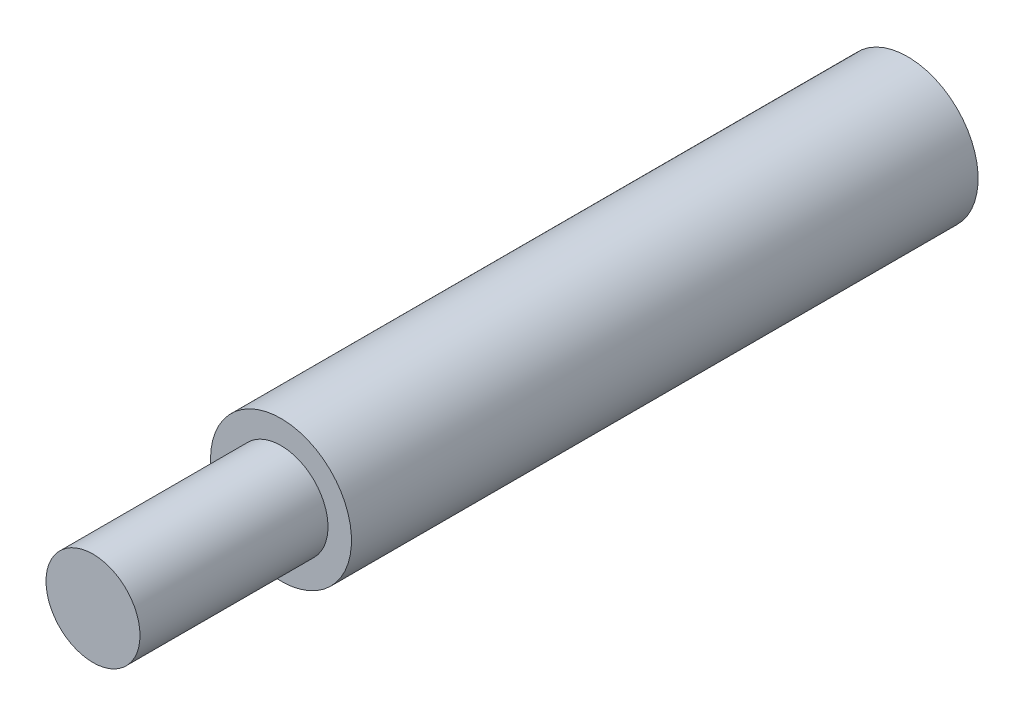
ISO-10303-21;
HEADER;
FILE_DESCRIPTION(('STEP AP214'),'2;1');
FILE_NAME('part.step','',(''),(''),'','','');
FILE_SCHEMA(('AUTOMOTIVE_DESIGN { 1 0 10303 214 1 1 1 1 }'));
ENDSEC;
DATA;
#1=APPLICATION_CONTEXT('core data for automotive mechanical design processes');
#2=APPLICATION_PROTOCOL_DEFINITION('international standard','automotive_design',2000,#1);
#3=PRODUCT_CONTEXT('',#1,'mechanical');
#4=PRODUCT('Part','Part','',(#3));
#5=PRODUCT_RELATED_PRODUCT_CATEGORY('part','',(#4));
#6=PRODUCT_DEFINITION_FORMATION('','',#4);
#7=PRODUCT_DEFINITION_CONTEXT('part definition',#1,'design');
#8=PRODUCT_DEFINITION('design','',#6,#7);
#9=PRODUCT_DEFINITION_SHAPE('','',#8);
#10=(LENGTH_UNIT() NAMED_UNIT(*) SI_UNIT(.MILLI.,.METRE.));
#11=(NAMED_UNIT(*) PLANE_ANGLE_UNIT() SI_UNIT($,.RADIAN.));
#12=(NAMED_UNIT(*) SI_UNIT($,.STERADIAN.) SOLID_ANGLE_UNIT());
#13=UNCERTAINTY_MEASURE_WITH_UNIT(LENGTH_MEASURE(1.E-05),#10,'distance_accuracy_value','');
#14=(GEOMETRIC_REPRESENTATION_CONTEXT(3) GLOBAL_UNCERTAINTY_ASSIGNED_CONTEXT((#13)) GLOBAL_UNIT_ASSIGNED_CONTEXT((#10,
#11,#12)) REPRESENTATION_CONTEXT('',''));
#15=CARTESIAN_POINT('',(0.,0.,0.));
#16=DIRECTION('',(0.,0.,1.));
#17=DIRECTION('',(1.,0.,0.));
#18=AXIS2_PLACEMENT_3D('',#15,#16,#17);
#19=CARTESIAN_POINT('',(0.,0.,6.));
#20=DIRECTION('',(0.,0.,-1.));
#21=DIRECTION('',(-1.,0.,0.));
#22=AXIS2_PLACEMENT_3D('',#19,#20,#21);
#23=CYLINDRICAL_SURFACE('',#22,1.5);
#24=CARTESIAN_POINT('',(0.,0.,6.));
#25=DIRECTION('',(0.,0.,1.));
#26=DIRECTION('',(1.,0.,0.));
#27=AXIS2_PLACEMENT_3D('',#24,#25,#26);
#28=CIRCLE('',#27,1.5);
#29=CARTESIAN_POINT('',(1.5,0.,6.));
#30=VERTEX_POINT('',#29);
#31=EDGE_CURVE('E10',#30,#30,#28,.T.);
#32=ORIENTED_EDGE('',*,*,#31,.F.);
#33=EDGE_LOOP('',(#32));
#34=FACE_BOUND('',#33,.T.);
#35=CARTESIAN_POINT('',(0.,0.,0.));
#36=DIRECTION('',(0.,0.,-1.));
#37=DIRECTION('',(-1.,0.,0.));
#38=AXIS2_PLACEMENT_3D('',#35,#36,#37);
#39=CIRCLE('',#38,1.5);
#40=CARTESIAN_POINT('',(-1.5,0.,0.));
#41=VERTEX_POINT('',#40);
#42=EDGE_CURVE('E39',#41,#41,#39,.T.);
#43=ORIENTED_EDGE('',*,*,#42,.F.);
#44=EDGE_LOOP('',(#43));
#45=FACE_BOUND('',#44,.T.);
#46=ADVANCED_FACE('F33',(#34,#45),#23,.T.);
#47=CARTESIAN_POINT('',(0.,0.,6.));
#48=DIRECTION('',(0.,0.,1.));
#49=DIRECTION('',(1.,0.,0.));
#50=AXIS2_PLACEMENT_3D('',#47,#48,#49);
#51=PLANE('',#50);
#52=ORIENTED_EDGE('',*,*,#31,.T.);
#53=EDGE_LOOP('',(#52));
#54=FACE_BOUND('',#53,.T.);
#55=ADVANCED_FACE('F81',(#54),#51,.T.);
#56=CARTESIAN_POINT('',(0.,0.,0.));
#57=DIRECTION('',(0.,0.,-1.));
#58=DIRECTION('',(-1.,0.,0.));
#59=AXIS2_PLACEMENT_3D('',#56,#57,#58);
#60=PLANE('',#59);
#61=CARTESIAN_POINT('',(0.,0.,0.));
#62=DIRECTION('',(0.,0.,-1.));
#63=DIRECTION('',(-1.,0.,0.));
#64=AXIS2_PLACEMENT_3D('',#61,#62,#63);
#65=CIRCLE('',#64,2.25);
#66=CARTESIAN_POINT('',(-2.25,0.,0.));
#67=VERTEX_POINT('',#66);
#68=EDGE_CURVE('E47',#67,#67,#65,.T.);
#69=ORIENTED_EDGE('',*,*,#68,.F.);
#70=EDGE_LOOP('',(#69));
#71=FACE_BOUND('',#70,.T.);
#72=ORIENTED_EDGE('',*,*,#42,.T.);
#73=EDGE_LOOP('',(#72));
#74=FACE_BOUND('',#73,.T.);
#75=ADVANCED_FACE('F76',(#71,#74),#60,.F.);
#76=CARTESIAN_POINT('',(0.,0.,-20.));
#77=DIRECTION('',(0.,0.,1.));
#78=DIRECTION('',(1.,0.,0.));
#79=AXIS2_PLACEMENT_3D('',#76,#77,#78);
#80=CYLINDRICAL_SURFACE('',#79,2.25);
#81=CARTESIAN_POINT('',(0.,0.,-20.));
#82=DIRECTION('',(0.,0.,-1.));
#83=DIRECTION('',(-1.,0.,0.));
#84=AXIS2_PLACEMENT_3D('',#81,#82,#83);
#85=CIRCLE('',#84,2.25);
#86=CARTESIAN_POINT('',(-2.25,0.,-20.));
#87=VERTEX_POINT('',#86);
#88=EDGE_CURVE('E43',#87,#87,#85,.T.);
#89=ORIENTED_EDGE('',*,*,#88,.F.);
#90=EDGE_LOOP('',(#89));
#91=FACE_BOUND('',#90,.T.);
#92=ORIENTED_EDGE('',*,*,#68,.T.);
#93=EDGE_LOOP('',(#92));
#94=FACE_BOUND('',#93,.T.);
#95=ADVANCED_FACE('F70',(#91,#94),#80,.T.);
#96=CARTESIAN_POINT('',(0.,0.,-20.));
#97=DIRECTION('',(0.,0.,-1.));
#98=DIRECTION('',(-1.,0.,0.));
#99=AXIS2_PLACEMENT_3D('',#96,#97,#98);
#100=PLANE('',#99);
#101=CARTESIAN_POINT('',(0.,0.,-20.));
#102=DIRECTION('',(0.,0.,-1.));
#103=DIRECTION('',(-1.,0.,0.));
#104=AXIS2_PLACEMENT_3D('',#101,#102,#103);
#105=CIRCLE('',#104,1.5);
#106=CARTESIAN_POINT('',(-1.5,0.,-20.));
#107=VERTEX_POINT('',#106);
#108=EDGE_CURVE('E53',#107,#107,#105,.T.);
#109=ORIENTED_EDGE('',*,*,#108,.F.);
#110=EDGE_LOOP('',(#109));
#111=FACE_BOUND('',#110,.T.);
#112=ORIENTED_EDGE('',*,*,#88,.T.);
#113=EDGE_LOOP('',(#112));
#114=FACE_BOUND('',#113,.T.);
#115=ADVANCED_FACE('F64',(#111,#114),#100,.T.);
#116=CARTESIAN_POINT('',(0.,0.,-15.5));
#117=DIRECTION('',(0.,0.,-1.));
#118=DIRECTION('',(-1.,0.,0.));
#119=AXIS2_PLACEMENT_3D('',#116,#117,#118);
#120=CYLINDRICAL_SURFACE('',#119,1.5);
#121=CARTESIAN_POINT('',(0.,0.,-15.5));
#122=DIRECTION('',(0.,0.,-1.));
#123=DIRECTION('',(-1.,0.,0.));
#124=AXIS2_PLACEMENT_3D('',#121,#122,#123);
#125=CIRCLE('',#124,1.5);
#126=CARTESIAN_POINT('',(-1.5,0.,-15.5));
#127=VERTEX_POINT('',#126);
#128=EDGE_CURVE('E51',#127,#127,#125,.T.);
#129=ORIENTED_EDGE('',*,*,#128,.F.);
#130=EDGE_LOOP('',(#129));
#131=FACE_BOUND('',#130,.T.);
#132=ORIENTED_EDGE('',*,*,#108,.T.);
#133=EDGE_LOOP('',(#132));
#134=FACE_BOUND('',#133,.T.);
#135=ADVANCED_FACE('F61',(#131,#134),#120,.F.);
#136=CARTESIAN_POINT('',(0.,0.,-15.5));
#137=DIRECTION('',(0.,0.,-1.));
#138=DIRECTION('',(-1.,0.,0.));
#139=AXIS2_PLACEMENT_3D('',#136,#137,#138);
#140=PLANE('',#139);
#141=ORIENTED_EDGE('',*,*,#128,.T.);
#142=EDGE_LOOP('',(#141));
#143=FACE_BOUND('',#142,.T.);
#144=ADVANCED_FACE('F59',(#143),#140,.T.);
#145=CLOSED_SHELL('',(#46,#55,#75,#95,#115,#135,#144));
#146=MANIFOLD_SOLID_BREP('B2',#145);
#147=ADVANCED_BREP_SHAPE_REPRESENTATION('',(#18,#146),#14);
#148=SHAPE_DEFINITION_REPRESENTATION(#9,#147);
ENDSEC;
END-ISO-10303-21;
